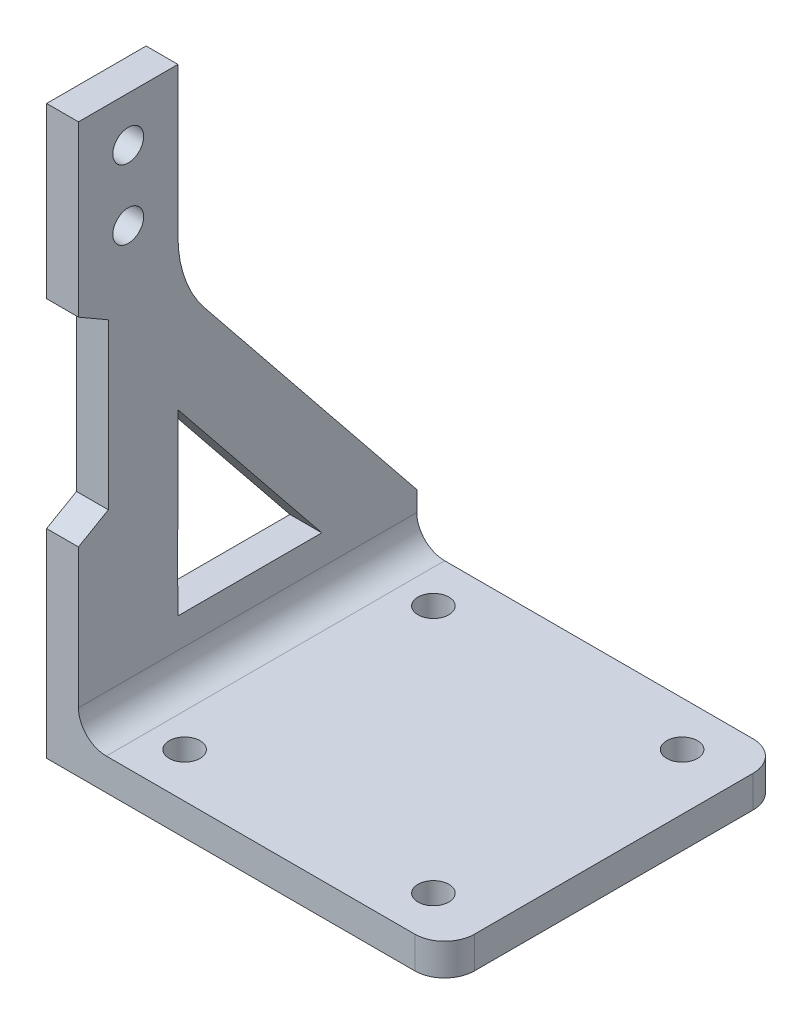
ISO-10303-21;
HEADER;
FILE_DESCRIPTION(('STEP AP214'),'2;1');
FILE_NAME('part.step','',(''),(''),'','','');
FILE_SCHEMA(('AUTOMOTIVE_DESIGN { 1 0 10303 214 1 1 1 1 }'));
ENDSEC;
DATA;
#1=APPLICATION_CONTEXT('core data for automotive mechanical design processes');
#2=APPLICATION_PROTOCOL_DEFINITION('international standard','automotive_design',2000,#1);
#3=PRODUCT_CONTEXT('',#1,'mechanical');
#4=PRODUCT('Part','Part','',(#3));
#5=PRODUCT_RELATED_PRODUCT_CATEGORY('part','',(#4));
#6=PRODUCT_DEFINITION_FORMATION('','',#4);
#7=PRODUCT_DEFINITION_CONTEXT('part definition',#1,'design');
#8=PRODUCT_DEFINITION('design','',#6,#7);
#9=PRODUCT_DEFINITION_SHAPE('','',#8);
#10=(LENGTH_UNIT() NAMED_UNIT(*) SI_UNIT(.MILLI.,.METRE.));
#11=(NAMED_UNIT(*) PLANE_ANGLE_UNIT() SI_UNIT($,.RADIAN.));
#12=(NAMED_UNIT(*) SI_UNIT($,.STERADIAN.) SOLID_ANGLE_UNIT());
#13=UNCERTAINTY_MEASURE_WITH_UNIT(LENGTH_MEASURE(1.E-05),#10,'distance_accuracy_value','');
#14=(GEOMETRIC_REPRESENTATION_CONTEXT(3) GLOBAL_UNCERTAINTY_ASSIGNED_CONTEXT((#13)) GLOBAL_UNIT_ASSIGNED_CONTEXT((#10,
#11,#12)) REPRESENTATION_CONTEXT('',''));
#15=CARTESIAN_POINT('',(0.,0.,0.));
#16=DIRECTION('',(0.,0.,1.));
#17=DIRECTION('',(1.,0.,0.));
#18=AXIS2_PLACEMENT_3D('',#15,#16,#17);
#19=CARTESIAN_POINT('',(0.,0.,-17.));
#20=DIRECTION('',(-1.,0.,0.));
#21=DIRECTION('',(0.,0.,1.));
#22=AXIS2_PLACEMENT_3D('',#19,#20,#21);
#23=PLANE('',#22);
#24=CARTESIAN_POINT('',(0.,45.47,12.));
#25=DIRECTION('',(-1.,0.,0.));
#26=DIRECTION('',(0.,0.,1.));
#27=AXIS2_PLACEMENT_3D('',#24,#25,#26);
#28=CIRCLE('',#27,1.55);
#29=CARTESIAN_POINT('',(0.,45.47,13.55));
#30=VERTEX_POINT('',#29);
#31=EDGE_CURVE('E315',#30,#30,#28,.T.);
#32=ORIENTED_EDGE('',*,*,#31,.F.);
#33=EDGE_LOOP('',(#32));
#34=FACE_BOUND('',#33,.T.);
#35=CARTESIAN_POINT('',(0.,52.47,12.));
#36=DIRECTION('',(-1.,0.,0.));
#37=DIRECTION('',(0.,0.,1.));
#38=AXIS2_PLACEMENT_3D('',#35,#36,#37);
#39=CIRCLE('',#38,1.55);
#40=CARTESIAN_POINT('',(0.,52.47,13.55));
#41=VERTEX_POINT('',#40);
#42=EDGE_CURVE('E310',#41,#41,#39,.T.);
#43=ORIENTED_EDGE('',*,*,#42,.F.);
#44=EDGE_LOOP('',(#43));
#45=FACE_BOUND('',#44,.T.);
#46=DIRECTION('',(0.,0.999965142877044,0.00834943296838955));
#47=VECTOR('',#46,1.);
#48=CARTESIAN_POINT('',(0.,12.4099026560482,7.02847174609856));
#49=LINE('',#48,#47);
#50=CARTESIAN_POINT('',(0.,9.,7.));
#51=VERTEX_POINT('',#50);
#52=CARTESIAN_POINT('',(0.,12.4099026560482,7.02847174609856));
#53=VERTEX_POINT('',#52);
#54=EDGE_CURVE('E309',#51,#53,#49,.T.);
#55=ORIENTED_EDGE('',*,*,#54,.F.);
#56=DIRECTION('',(0.,0.,1.));
#57=VECTOR('',#56,1.);
#58=CARTESIAN_POINT('',(0.,9.,-7.45470915295073));
#59=LINE('',#58,#57);
#60=CARTESIAN_POINT('',(0.,9.,-7.45470915295073));
#61=VERTEX_POINT('',#60);
#62=EDGE_CURVE('E513',#61,#51,#59,.T.);
#63=ORIENTED_EDGE('',*,*,#62,.F.);
#64=DIRECTION('',(0.,-0.778824836888192,-0.627241479373041));
#65=VECTOR('',#64,1.);
#66=CARTESIAN_POINT('',(0.,26.9537651825972,7.0046990477987));
#67=LINE('',#66,#65);
#68=CARTESIAN_POINT('',(0.,26.9537651825972,7.0046990477987));
#69=VERTEX_POINT('',#68);
#70=EDGE_CURVE('E509',#69,#61,#67,.T.);
#71=ORIENTED_EDGE('',*,*,#70,.F.);
#72=DIRECTION('',(0.,0.999998664122701,-0.00163454972838609));
#73=VECTOR('',#72,1.);
#74=CARTESIAN_POINT('',(0.,26.9537651825972,7.0046990477987));
#75=LINE('',#74,#73);
#76=EDGE_CURVE('E505',#53,#69,#75,.T.);
#77=ORIENTED_EDGE('',*,*,#76,.F.);
#78=EDGE_LOOP('',(#55,#63,#71,#77));
#79=FACE_BOUND('',#78,.T.);
#80=DIRECTION('',(0.,-1.,0.));
#81=VECTOR('',#80,1.);
#82=CARTESIAN_POINT('',(0.,0.,17.));
#83=LINE('',#82,#81);
#84=CARTESIAN_POINT('',(0.,20.,17.));
#85=VERTEX_POINT('',#84);
#86=CARTESIAN_POINT('',(0.,0.,17.));
#87=VERTEX_POINT('',#86);
#88=EDGE_CURVE('E206',#85,#87,#83,.T.);
#89=ORIENTED_EDGE('',*,*,#88,.F.);
#90=DIRECTION('',(0.,0.499999999999998,-0.86602540378444));
#91=VECTOR('',#90,1.);
#92=CARTESIAN_POINT('',(0.,20.,17.));
#93=LINE('',#92,#91);
#94=CARTESIAN_POINT('',(0.,21.7320508075689,14.));
#95=VERTEX_POINT('',#94);
#96=EDGE_CURVE('E187',#85,#95,#93,.T.);
#97=ORIENTED_EDGE('',*,*,#96,.T.);
#98=DIRECTION('',(0.,1.,0.));
#99=VECTOR('',#98,1.);
#100=CARTESIAN_POINT('',(0.,21.7320508075689,14.));
#101=LINE('',#100,#99);
#102=CARTESIAN_POINT('',(0.,38.2679491924311,14.));
#103=VERTEX_POINT('',#102);
#104=EDGE_CURVE('E196',#95,#103,#101,.T.);
#105=ORIENTED_EDGE('',*,*,#104,.T.);
#106=DIRECTION('',(0.,0.499999999999999,0.866025403784439));
#107=VECTOR('',#106,1.);
#108=CARTESIAN_POINT('',(0.,38.2679491924311,14.));
#109=LINE('',#108,#107);
#110=CARTESIAN_POINT('',(0.,40.,17.));
#111=VERTEX_POINT('',#110);
#112=EDGE_CURVE('E178',#103,#111,#109,.T.);
#113=ORIENTED_EDGE('',*,*,#112,.T.);
#114=CARTESIAN_POINT('',(0.,57.,17.));
#115=VERTEX_POINT('',#114);
#116=EDGE_CURVE('E193',#115,#111,#83,.T.);
#117=ORIENTED_EDGE('',*,*,#116,.F.);
#118=DIRECTION('',(0.,0.,1.));
#119=VECTOR('',#118,1.);
#120=CARTESIAN_POINT('',(0.,57.,-17.));
#121=LINE('',#120,#119);
#122=CARTESIAN_POINT('',(0.,57.,7.));
#123=VERTEX_POINT('',#122);
#124=EDGE_CURVE('E231',#123,#115,#121,.T.);
#125=ORIENTED_EDGE('',*,*,#124,.F.);
#126=DIRECTION('',(0.,-1.,0.));
#127=VECTOR('',#126,1.);
#128=CARTESIAN_POINT('',(0.,0.,7.));
#129=LINE('',#128,#127);
#130=CARTESIAN_POINT('',(0.,42.0313878221105,7.));
#131=VERTEX_POINT('',#130);
#132=EDGE_CURVE('E338',#123,#131,#129,.T.);
#133=ORIENTED_EDGE('',*,*,#132,.T.);
#134=CARTESIAN_POINT('',(0.,42.0313878221105,-5.));
#135=DIRECTION('',(-1.,0.,0.));
#136=DIRECTION('',(0.,0.,1.));
#137=AXIS2_PLACEMENT_3D('',#134,#135,#136);
#138=CIRCLE('',#137,12.);
#139=CARTESIAN_POINT('',(0.,34.504490069634,4.34589804265831));
#140=VERTEX_POINT('',#139);
#141=EDGE_CURVE('E11',#131,#140,#138,.F.);
#142=ORIENTED_EDGE('',*,*,#141,.T.);
#143=DIRECTION('',(0.,-0.778824836888192,-0.627241479373041));
#144=VECTOR('',#143,1.);
#145=CARTESIAN_POINT('',(0.,3.14745498756865,-20.9080899428977));
#146=LINE('',#145,#144);
#147=CARTESIAN_POINT('',(0.,7.99999999999999,-17.));
#148=VERTEX_POINT('',#147);
#149=EDGE_CURVE('E327',#140,#148,#146,.T.);
#150=ORIENTED_EDGE('',*,*,#149,.T.);
#151=DIRECTION('',(0.,-1.,0.));
#152=VECTOR('',#151,1.);
#153=CARTESIAN_POINT('',(0.,0.,-17.));
#154=LINE('',#153,#152);
#155=CARTESIAN_POINT('',(0.,0.,-17.));
#156=VERTEX_POINT('',#155);
#157=EDGE_CURVE('E222',#148,#156,#154,.T.);
#158=ORIENTED_EDGE('',*,*,#157,.T.);
#159=DIRECTION('',(0.,0.,1.));
#160=VECTOR('',#159,1.);
#161=CARTESIAN_POINT('',(0.,0.,-17.));
#162=LINE('',#161,#160);
#163=EDGE_CURVE('E226',#156,#87,#162,.T.);
#164=ORIENTED_EDGE('',*,*,#163,.T.);
#165=EDGE_LOOP('',(#89,#97,#105,#113,#117,#125,#133,#142,#150,#158,#164));
#166=FACE_BOUND('',#165,.T.);
#167=ADVANCED_FACE('F39',(#34,#45,#79,#166),#23,.T.);
#168=CARTESIAN_POINT('',(3.2,3.2,-17.));
#169=DIRECTION('',(1.,0.,0.));
#170=DIRECTION('',(0.,0.,-1.));
#171=AXIS2_PLACEMENT_3D('',#168,#169,#170);
#172=PLANE('',#171);
#173=CARTESIAN_POINT('',(3.2,45.47,12.));
#174=DIRECTION('',(1.,0.,0.));
#175=DIRECTION('',(0.,0.,-1.));
#176=AXIS2_PLACEMENT_3D('',#173,#174,#175);
#177=CIRCLE('',#176,1.55);
#178=CARTESIAN_POINT('',(3.2,45.47,10.45));
#179=VERTEX_POINT('',#178);
#180=EDGE_CURVE('E311',#179,#179,#177,.T.);
#181=ORIENTED_EDGE('',*,*,#180,.F.);
#182=EDGE_LOOP('',(#181));
#183=FACE_BOUND('',#182,.T.);
#184=CARTESIAN_POINT('',(3.2,52.47,12.));
#185=DIRECTION('',(1.,0.,0.));
#186=DIRECTION('',(0.,0.,-1.));
#187=AXIS2_PLACEMENT_3D('',#184,#185,#186);
#188=CIRCLE('',#187,1.55);
#189=CARTESIAN_POINT('',(3.2,52.47,10.45));
#190=VERTEX_POINT('',#189);
#191=EDGE_CURVE('E305',#190,#190,#188,.T.);
#192=ORIENTED_EDGE('',*,*,#191,.F.);
#193=EDGE_LOOP('',(#192));
#194=FACE_BOUND('',#193,.T.);
#195=DIRECTION('',(0.,-0.999965142877044,-0.00834943296838955));
#196=VECTOR('',#195,1.);
#197=CARTESIAN_POINT('',(3.2,3.00002492923091,6.94990186405772));
#198=LINE('',#197,#196);
#199=CARTESIAN_POINT('',(3.2,12.4099026560482,7.02847174609856));
#200=VERTEX_POINT('',#199);
#201=CARTESIAN_POINT('',(3.2,9.,7.));
#202=VERTEX_POINT('',#201);
#203=EDGE_CURVE('E301',#200,#202,#198,.T.);
#204=ORIENTED_EDGE('',*,*,#203,.F.);
#205=DIRECTION('',(0.,-0.9999986641227,0.00163454972838609));
#206=VECTOR('',#205,1.);
#207=CARTESIAN_POINT('',(3.2,3.2393002860819,7.0434615717361));
#208=LINE('',#207,#206);
#209=CARTESIAN_POINT('',(3.2,26.9537651825972,7.0046990477987));
#210=VERTEX_POINT('',#209);
#211=EDGE_CURVE('E291',#210,#200,#208,.T.);
#212=ORIENTED_EDGE('',*,*,#211,.F.);
#213=DIRECTION('',(0.,0.778824836888192,0.627241479373041));
#214=VECTOR('',#213,1.);
#215=CARTESIAN_POINT('',(3.2,0.818922970813886,-14.0434960220939));
#216=LINE('',#215,#214);
#217=CARTESIAN_POINT('',(3.2,9.,-7.45470915295073));
#218=VERTEX_POINT('',#217);
#219=EDGE_CURVE('E294',#218,#210,#216,.T.);
#220=ORIENTED_EDGE('',*,*,#219,.F.);
#221=DIRECTION('',(0.,0.,-1.));
#222=VECTOR('',#221,1.);
#223=CARTESIAN_POINT('',(3.2,9.,-17.));
#224=LINE('',#223,#222);
#225=EDGE_CURVE('E298',#202,#218,#224,.T.);
#226=ORIENTED_EDGE('',*,*,#225,.F.);
#227=EDGE_LOOP('',(#204,#212,#220,#226));
#228=FACE_BOUND('',#227,.T.);
#229=DIRECTION('',(0.,1.,0.));
#230=VECTOR('',#229,1.);
#231=CARTESIAN_POINT('',(3.2,21.7320508075689,14.));
#232=LINE('',#231,#230);
#233=CARTESIAN_POINT('',(3.2,21.7320508075689,14.));
#234=VERTEX_POINT('',#233);
#235=CARTESIAN_POINT('',(3.2,38.2679491924311,14.));
#236=VERTEX_POINT('',#235);
#237=EDGE_CURVE('E477',#234,#236,#232,.T.);
#238=ORIENTED_EDGE('',*,*,#237,.F.);
#239=DIRECTION('',(0.,0.499999999999998,-0.86602540378444));
#240=VECTOR('',#239,1.);
#241=CARTESIAN_POINT('',(3.2,20.,17.));
#242=LINE('',#241,#240);
#243=CARTESIAN_POINT('',(3.2,20.,17.));
#244=VERTEX_POINT('',#243);
#245=EDGE_CURVE('E198',#244,#234,#242,.T.);
#246=ORIENTED_EDGE('',*,*,#245,.F.);
#247=DIRECTION('',(0.,1.,0.));
#248=VECTOR('',#247,1.);
#249=CARTESIAN_POINT('',(3.2,3.2,17.));
#250=LINE('',#249,#248);
#251=CARTESIAN_POINT('',(3.2,6.,17.));
#252=VERTEX_POINT('',#251);
#253=EDGE_CURVE('E386',#252,#244,#250,.T.);
#254=ORIENTED_EDGE('',*,*,#253,.F.);
#255=DIRECTION('',(0.,0.,1.));
#256=VECTOR('',#255,1.);
#257=CARTESIAN_POINT('',(3.2,6.,-17.));
#258=LINE('',#257,#256);
#259=CARTESIAN_POINT('',(3.2,6.,-17.));
#260=VERTEX_POINT('',#259);
#261=EDGE_CURVE('E248',#252,#260,#258,.F.);
#262=ORIENTED_EDGE('',*,*,#261,.T.);
#263=DIRECTION('',(0.,1.,0.));
#264=VECTOR('',#263,1.);
#265=CARTESIAN_POINT('',(3.2,3.2,-17.));
#266=LINE('',#265,#264);
#267=CARTESIAN_POINT('',(3.2,7.99999999999999,-17.));
#268=VERTEX_POINT('',#267);
#269=EDGE_CURVE('E218',#260,#268,#266,.T.);
#270=ORIENTED_EDGE('',*,*,#269,.T.);
#271=DIRECTION('',(0.,0.778824836888192,0.627241479373041));
#272=VECTOR('',#271,1.);
#273=CARTESIAN_POINT('',(3.2,5.08847299254119,-19.3448539657386));
#274=LINE('',#273,#272);
#275=CARTESIAN_POINT('',(3.2,34.504490069634,4.34589804265831));
#276=VERTEX_POINT('',#275);
#277=EDGE_CURVE('E325',#268,#276,#274,.T.);
#278=ORIENTED_EDGE('',*,*,#277,.T.);
#279=CARTESIAN_POINT('',(3.2,42.0313878221105,-5.));
#280=DIRECTION('',(1.,0.,0.));
#281=DIRECTION('',(0.,0.,-1.));
#282=AXIS2_PLACEMENT_3D('',#279,#280,#281);
#283=CIRCLE('',#282,12.);
#284=CARTESIAN_POINT('',(3.2,42.0313878221105,7.));
#285=VERTEX_POINT('',#284);
#286=EDGE_CURVE('E48',#276,#285,#283,.F.);
#287=ORIENTED_EDGE('',*,*,#286,.T.);
#288=DIRECTION('',(0.,1.,0.));
#289=VECTOR('',#288,1.);
#290=CARTESIAN_POINT('',(3.2,3.2,7.));
#291=LINE('',#290,#289);
#292=CARTESIAN_POINT('',(3.2,57.,7.));
#293=VERTEX_POINT('',#292);
#294=EDGE_CURVE('E262',#285,#293,#291,.T.);
#295=ORIENTED_EDGE('',*,*,#294,.T.);
#296=DIRECTION('',(0.,0.,1.));
#297=VECTOR('',#296,1.);
#298=CARTESIAN_POINT('',(3.2,57.,-17.));
#299=LINE('',#298,#297);
#300=CARTESIAN_POINT('',(3.2,57.,17.));
#301=VERTEX_POINT('',#300);
#302=EDGE_CURVE('E234',#293,#301,#299,.T.);
#303=ORIENTED_EDGE('',*,*,#302,.T.);
#304=CARTESIAN_POINT('',(3.2,40.,17.));
#305=VERTEX_POINT('',#304);
#306=EDGE_CURVE('E385',#305,#301,#250,.T.);
#307=ORIENTED_EDGE('',*,*,#306,.F.);
#308=DIRECTION('',(0.,0.499999999999999,0.866025403784439));
#309=VECTOR('',#308,1.);
#310=CARTESIAN_POINT('',(3.2,38.2679491924311,14.));
#311=LINE('',#310,#309);
#312=EDGE_CURVE('E181',#236,#305,#311,.T.);
#313=ORIENTED_EDGE('',*,*,#312,.F.);
#314=EDGE_LOOP('',(#238,#246,#254,#262,#270,#278,#287,#295,#303,#307,#313));
#315=FACE_BOUND('',#314,.T.);
#316=ADVANCED_FACE('F331',(#183,#194,#228,#315),#172,.T.);
#317=CARTESIAN_POINT('',(0.,0.,17.));
#318=DIRECTION('',(0.,0.,1.));
#319=DIRECTION('',(1.,0.,0.));
#320=AXIS2_PLACEMENT_3D('',#317,#318,#319);
#321=PLANE('',#320);
#322=ORIENTED_EDGE('',*,*,#253,.T.);
#323=DIRECTION('',(-1.,0.,0.));
#324=VECTOR('',#323,1.);
#325=CARTESIAN_POINT('',(40.001,20.,17.));
#326=LINE('',#325,#324);
#327=EDGE_CURVE('E460',#244,#85,#326,.T.);
#328=ORIENTED_EDGE('',*,*,#327,.T.);
#329=ORIENTED_EDGE('',*,*,#88,.T.);
#330=DIRECTION('',(1.,0.,0.));
#331=VECTOR('',#330,1.);
#332=CARTESIAN_POINT('',(0.,0.,17.));
#333=LINE('',#332,#331);
#334=CARTESIAN_POINT('',(37.,0.,17.));
#335=VERTEX_POINT('',#334);
#336=EDGE_CURVE('E376',#87,#335,#333,.T.);
#337=ORIENTED_EDGE('',*,*,#336,.T.);
#338=DIRECTION('',(0.,1.,0.));
#339=VECTOR('',#338,1.);
#340=CARTESIAN_POINT('',(37.,0.,17.));
#341=LINE('',#340,#339);
#342=CARTESIAN_POINT('',(37.,3.2,17.));
#343=VERTEX_POINT('',#342);
#344=EDGE_CURVE('E287',#335,#343,#341,.T.);
#345=ORIENTED_EDGE('',*,*,#344,.T.);
#346=DIRECTION('',(-1.,0.,0.));
#347=VECTOR('',#346,1.);
#348=CARTESIAN_POINT('',(3.2,3.2,17.));
#349=LINE('',#348,#347);
#350=CARTESIAN_POINT('',(6.,3.2,17.));
#351=VERTEX_POINT('',#350);
#352=EDGE_CURVE('E383',#343,#351,#349,.T.);
#353=ORIENTED_EDGE('',*,*,#352,.T.);
#354=CARTESIAN_POINT('',(6.,6.,17.));
#355=DIRECTION('',(0.,0.,1.));
#356=DIRECTION('',(1.,0.,0.));
#357=AXIS2_PLACEMENT_3D('',#354,#355,#356);
#358=CIRCLE('',#357,2.8);
#359=EDGE_CURVE('E251',#351,#252,#358,.F.);
#360=ORIENTED_EDGE('',*,*,#359,.T.);
#361=EDGE_LOOP('',(#322,#328,#329,#337,#345,#353,#360));
#362=FACE_BOUND('',#361,.T.);
#363=ADVANCED_FACE('F410',(#362),#321,.T.);
#364=ORIENTED_EDGE('',*,*,#116,.T.);
#365=DIRECTION('',(-1.,0.,0.));
#366=VECTOR('',#365,1.);
#367=CARTESIAN_POINT('',(40.001,40.,17.));
#368=LINE('',#367,#366);
#369=EDGE_CURVE('E175',#305,#111,#368,.T.);
#370=ORIENTED_EDGE('',*,*,#369,.F.);
#371=ORIENTED_EDGE('',*,*,#306,.T.);
#372=DIRECTION('',(-1.,0.,0.));
#373=VECTOR('',#372,1.);
#374=CARTESIAN_POINT('',(0.,57.,17.));
#375=LINE('',#374,#373);
#376=EDGE_CURVE('E203',#301,#115,#375,.T.);
#377=ORIENTED_EDGE('',*,*,#376,.T.);
#378=EDGE_LOOP('',(#364,#370,#371,#377));
#379=FACE_BOUND('',#378,.T.);
#380=ADVANCED_FACE('F201',(#379),#321,.T.);
#381=CARTESIAN_POINT('',(0.,57.,-17.));
#382=DIRECTION('',(0.,1.,0.));
#383=DIRECTION('',(0.,0.,1.));
#384=AXIS2_PLACEMENT_3D('',#381,#382,#383);
#385=PLANE('',#384);
#386=ORIENTED_EDGE('',*,*,#302,.F.);
#387=DIRECTION('',(1.,0.,0.));
#388=VECTOR('',#387,1.);
#389=CARTESIAN_POINT('',(-1.2E-05,57.,7.));
#390=LINE('',#389,#388);
#391=EDGE_CURVE('E334',#123,#293,#390,.T.);
#392=ORIENTED_EDGE('',*,*,#391,.F.);
#393=ORIENTED_EDGE('',*,*,#124,.T.);
#394=ORIENTED_EDGE('',*,*,#376,.F.);
#395=EDGE_LOOP('',(#386,#392,#393,#394));
#396=FACE_BOUND('',#395,.T.);
#397=ADVANCED_FACE('F397',(#396),#385,.T.);
#398=CARTESIAN_POINT('',(0.,0.,-17.));
#399=DIRECTION('',(0.,0.,1.));
#400=DIRECTION('',(1.,0.,0.));
#401=AXIS2_PLACEMENT_3D('',#398,#399,#400);
#402=PLANE('',#401);
#403=DIRECTION('',(-1.,0.,0.));
#404=VECTOR('',#403,1.);
#405=CARTESIAN_POINT('',(3.2,3.2,-17.));
#406=LINE('',#405,#404);
#407=CARTESIAN_POINT('',(37.,3.2,-17.));
#408=VERTEX_POINT('',#407);
#409=CARTESIAN_POINT('',(6.,3.2,-17.));
#410=VERTEX_POINT('',#409);
#411=EDGE_CURVE('E211',#408,#410,#406,.T.);
#412=ORIENTED_EDGE('',*,*,#411,.F.);
#413=DIRECTION('',(0.,1.,0.));
#414=VECTOR('',#413,1.);
#415=CARTESIAN_POINT('',(37.,0.,-17.));
#416=LINE('',#415,#414);
#417=CARTESIAN_POINT('',(37.,0.,-17.));
#418=VERTEX_POINT('',#417);
#419=EDGE_CURVE('E278',#408,#418,#416,.F.);
#420=ORIENTED_EDGE('',*,*,#419,.T.);
#421=DIRECTION('',(1.,0.,0.));
#422=VECTOR('',#421,1.);
#423=CARTESIAN_POINT('',(0.,0.,-17.));
#424=LINE('',#423,#422);
#425=EDGE_CURVE('E205',#156,#418,#424,.T.);
#426=ORIENTED_EDGE('',*,*,#425,.F.);
#427=ORIENTED_EDGE('',*,*,#157,.F.);
#428=DIRECTION('',(-1.,0.,0.));
#429=VECTOR('',#428,1.);
#430=CARTESIAN_POINT('',(0.,7.99999999999999,-17.));
#431=LINE('',#430,#429);
#432=EDGE_CURVE('E258',#268,#148,#431,.T.);
#433=ORIENTED_EDGE('',*,*,#432,.F.);
#434=ORIENTED_EDGE('',*,*,#269,.F.);
#435=CARTESIAN_POINT('',(6.,6.,-17.));
#436=DIRECTION('',(0.,0.,1.));
#437=DIRECTION('',(1.,0.,0.));
#438=AXIS2_PLACEMENT_3D('',#435,#436,#437);
#439=CIRCLE('',#438,2.8);
#440=EDGE_CURVE('E254',#260,#410,#439,.T.);
#441=ORIENTED_EDGE('',*,*,#440,.T.);
#442=EDGE_LOOP('',(#412,#420,#426,#427,#433,#434,#441));
#443=FACE_BOUND('',#442,.T.);
#444=ADVANCED_FACE('F417',(#443),#402,.F.);
#445=CARTESIAN_POINT('',(0.,0.,-17.));
#446=DIRECTION('',(0.,-1.,0.));
#447=DIRECTION('',(0.,0.,-1.));
#448=AXIS2_PLACEMENT_3D('',#445,#446,#447);
#449=PLANE('',#448);
#450=CARTESIAN_POINT('',(34.37,0.,12.5));
#451=DIRECTION('',(0.,-1.,0.));
#452=DIRECTION('',(0.,0.,-1.));
#453=AXIS2_PLACEMENT_3D('',#450,#451,#452);
#454=CIRCLE('',#453,1.55);
#455=CARTESIAN_POINT('',(34.37,0.,10.95));
#456=VERTEX_POINT('',#455);
#457=EDGE_CURVE('E348',#456,#456,#454,.T.);
#458=ORIENTED_EDGE('',*,*,#457,.F.);
#459=EDGE_LOOP('',(#458));
#460=FACE_BOUND('',#459,.T.);
#461=CARTESIAN_POINT('',(9.37,0.,-12.5));
#462=DIRECTION('',(0.,-1.,0.));
#463=DIRECTION('',(0.,0.,-1.));
#464=AXIS2_PLACEMENT_3D('',#461,#462,#463);
#465=CIRCLE('',#464,1.55);
#466=CARTESIAN_POINT('',(9.37,0.,-14.05));
#467=VERTEX_POINT('',#466);
#468=EDGE_CURVE('E357',#467,#467,#465,.T.);
#469=ORIENTED_EDGE('',*,*,#468,.F.);
#470=EDGE_LOOP('',(#469));
#471=FACE_BOUND('',#470,.T.);
#472=CARTESIAN_POINT('',(34.37,0.,-12.5));
#473=DIRECTION('',(0.,-1.,0.));
#474=DIRECTION('',(0.,0.,-1.));
#475=AXIS2_PLACEMENT_3D('',#472,#473,#474);
#476=CIRCLE('',#475,1.55);
#477=CARTESIAN_POINT('',(34.37,0.,-14.05));
#478=VERTEX_POINT('',#477);
#479=EDGE_CURVE('E365',#478,#478,#476,.T.);
#480=ORIENTED_EDGE('',*,*,#479,.F.);
#481=EDGE_LOOP('',(#480));
#482=FACE_BOUND('',#481,.T.);
#483=CARTESIAN_POINT('',(9.37,0.,12.5));
#484=DIRECTION('',(0.,-1.,0.));
#485=DIRECTION('',(0.,0.,-1.));
#486=AXIS2_PLACEMENT_3D('',#483,#484,#485);
#487=CIRCLE('',#486,1.55);
#488=CARTESIAN_POINT('',(9.37,0.,10.95));
#489=VERTEX_POINT('',#488);
#490=EDGE_CURVE('E372',#489,#489,#487,.T.);
#491=ORIENTED_EDGE('',*,*,#490,.F.);
#492=EDGE_LOOP('',(#491));
#493=FACE_BOUND('',#492,.T.);
#494=ORIENTED_EDGE('',*,*,#425,.T.);
#495=CARTESIAN_POINT('',(37.,0.,-14.));
#496=DIRECTION('',(0.,-1.,0.));
#497=DIRECTION('',(0.,0.,-1.));
#498=AXIS2_PLACEMENT_3D('',#495,#496,#497);
#499=CIRCLE('',#498,3.);
#500=CARTESIAN_POINT('',(40.,0.,-14.));
#501=VERTEX_POINT('',#500);
#502=EDGE_CURVE('E284',#418,#501,#499,.T.);
#503=ORIENTED_EDGE('',*,*,#502,.T.);
#504=DIRECTION('',(0.,0.,1.));
#505=VECTOR('',#504,1.);
#506=CARTESIAN_POINT('',(40.,0.,-17.));
#507=LINE('',#506,#505);
#508=CARTESIAN_POINT('',(40.,0.,14.));
#509=VERTEX_POINT('',#508);
#510=EDGE_CURVE('E225',#501,#509,#507,.T.);
#511=ORIENTED_EDGE('',*,*,#510,.T.);
#512=CARTESIAN_POINT('',(37.,0.,14.));
#513=DIRECTION('',(0.,-1.,0.));
#514=DIRECTION('',(0.,0.,-1.));
#515=AXIS2_PLACEMENT_3D('',#512,#513,#514);
#516=CIRCLE('',#515,3.);
#517=EDGE_CURVE('E281',#509,#335,#516,.T.);
#518=ORIENTED_EDGE('',*,*,#517,.T.);
#519=ORIENTED_EDGE('',*,*,#336,.F.);
#520=ORIENTED_EDGE('',*,*,#163,.F.);
#521=EDGE_LOOP('',(#494,#503,#511,#518,#519,#520));
#522=FACE_BOUND('',#521,.T.);
#523=ADVANCED_FACE('F425',(#460,#471,#482,#493,#522),#449,.T.);
#524=CARTESIAN_POINT('',(3.2,3.2,-17.));
#525=DIRECTION('',(0.,1.,0.));
#526=DIRECTION('',(0.,0.,1.));
#527=AXIS2_PLACEMENT_3D('',#524,#525,#526);
#528=PLANE('',#527);
#529=CARTESIAN_POINT('',(34.37,3.2,12.5));
#530=DIRECTION('',(0.,1.,0.));
#531=DIRECTION('',(0.,0.,1.));
#532=AXIS2_PLACEMENT_3D('',#529,#530,#531);
#533=CIRCLE('',#532,1.55);
#534=CARTESIAN_POINT('',(34.37,3.2,14.05));
#535=VERTEX_POINT('',#534);
#536=EDGE_CURVE('E353',#535,#535,#533,.F.);
#537=ORIENTED_EDGE('',*,*,#536,.T.);
#538=EDGE_LOOP('',(#537));
#539=FACE_BOUND('',#538,.T.);
#540=CARTESIAN_POINT('',(9.37,3.2,-12.5));
#541=DIRECTION('',(0.,1.,0.));
#542=DIRECTION('',(0.,0.,1.));
#543=AXIS2_PLACEMENT_3D('',#540,#541,#542);
#544=CIRCLE('',#543,1.55);
#545=CARTESIAN_POINT('',(9.37,3.2,-10.95));
#546=VERTEX_POINT('',#545);
#547=EDGE_CURVE('E361',#546,#546,#544,.F.);
#548=ORIENTED_EDGE('',*,*,#547,.T.);
#549=EDGE_LOOP('',(#548));
#550=FACE_BOUND('',#549,.T.);
#551=CARTESIAN_POINT('',(34.37,3.2,-12.5));
#552=DIRECTION('',(0.,1.,0.));
#553=DIRECTION('',(0.,0.,1.));
#554=AXIS2_PLACEMENT_3D('',#551,#552,#553);
#555=CIRCLE('',#554,1.55);
#556=CARTESIAN_POINT('',(34.37,3.2,-10.95));
#557=VERTEX_POINT('',#556);
#558=EDGE_CURVE('E347',#557,#557,#555,.F.);
#559=ORIENTED_EDGE('',*,*,#558,.T.);
#560=EDGE_LOOP('',(#559));
#561=FACE_BOUND('',#560,.T.);
#562=CARTESIAN_POINT('',(9.37,3.2,12.5));
#563=DIRECTION('',(0.,1.,0.));
#564=DIRECTION('',(0.,0.,1.));
#565=AXIS2_PLACEMENT_3D('',#562,#563,#564);
#566=CIRCLE('',#565,1.55);
#567=CARTESIAN_POINT('',(9.37,3.2,14.05));
#568=VERTEX_POINT('',#567);
#569=EDGE_CURVE('E352',#568,#568,#566,.F.);
#570=ORIENTED_EDGE('',*,*,#569,.T.);
#571=EDGE_LOOP('',(#570));
#572=FACE_BOUND('',#571,.T.);
#573=DIRECTION('',(0.,0.,1.));
#574=VECTOR('',#573,1.);
#575=CARTESIAN_POINT('',(40.,3.2,-17.));
#576=LINE('',#575,#574);
#577=CARTESIAN_POINT('',(40.,3.2,-14.));
#578=VERTEX_POINT('',#577);
#579=CARTESIAN_POINT('',(40.,3.2,14.));
#580=VERTEX_POINT('',#579);
#581=EDGE_CURVE('E238',#578,#580,#576,.T.);
#582=ORIENTED_EDGE('',*,*,#581,.F.);
#583=CARTESIAN_POINT('',(37.,3.2,-14.));
#584=DIRECTION('',(0.,1.,0.));
#585=DIRECTION('',(0.,0.,1.));
#586=AXIS2_PLACEMENT_3D('',#583,#584,#585);
#587=CIRCLE('',#586,3.);
#588=EDGE_CURVE('E275',#578,#408,#587,.T.);
#589=ORIENTED_EDGE('',*,*,#588,.T.);
#590=ORIENTED_EDGE('',*,*,#411,.T.);
#591=DIRECTION('',(0.,0.,1.));
#592=VECTOR('',#591,1.);
#593=CARTESIAN_POINT('',(6.,3.2,17.));
#594=LINE('',#593,#592);
#595=EDGE_CURVE('E230',#410,#351,#594,.T.);
#596=ORIENTED_EDGE('',*,*,#595,.T.);
#597=ORIENTED_EDGE('',*,*,#352,.F.);
#598=CARTESIAN_POINT('',(37.,3.2,14.));
#599=DIRECTION('',(0.,1.,0.));
#600=DIRECTION('',(0.,0.,1.));
#601=AXIS2_PLACEMENT_3D('',#598,#599,#600);
#602=CIRCLE('',#601,3.);
#603=EDGE_CURVE('E272',#343,#580,#602,.T.);
#604=ORIENTED_EDGE('',*,*,#603,.T.);
#605=EDGE_LOOP('',(#582,#589,#590,#596,#597,#604));
#606=FACE_BOUND('',#605,.T.);
#607=ADVANCED_FACE('F421',(#539,#550,#561,#572,#606),#528,.T.);
#608=CARTESIAN_POINT('',(40.,0.,-17.));
#609=DIRECTION('',(1.,0.,0.));
#610=DIRECTION('',(0.,0.,-1.));
#611=AXIS2_PLACEMENT_3D('',#608,#609,#610);
#612=PLANE('',#611);
#613=ORIENTED_EDGE('',*,*,#510,.F.);
#614=DIRECTION('',(0.,1.,0.));
#615=VECTOR('',#614,1.);
#616=CARTESIAN_POINT('',(40.,3.2,-14.));
#617=LINE('',#616,#615);
#618=EDGE_CURVE('E268',#501,#578,#617,.T.);
#619=ORIENTED_EDGE('',*,*,#618,.T.);
#620=ORIENTED_EDGE('',*,*,#581,.T.);
#621=DIRECTION('',(0.,1.,0.));
#622=VECTOR('',#621,1.);
#623=CARTESIAN_POINT('',(40.,0.,14.));
#624=LINE('',#623,#622);
#625=EDGE_CURVE('E265',#580,#509,#624,.F.);
#626=ORIENTED_EDGE('',*,*,#625,.T.);
#627=EDGE_LOOP('',(#613,#619,#620,#626));
#628=FACE_BOUND('',#627,.T.);
#629=ADVANCED_FACE('F424',(#628),#612,.T.);
#630=CARTESIAN_POINT('',(6.,6.,-17.));
#631=DIRECTION('',(0.,0.,-1.));
#632=DIRECTION('',(-1.,0.,0.));
#633=AXIS2_PLACEMENT_3D('',#630,#631,#632);
#634=CYLINDRICAL_SURFACE('',#633,2.8);
#635=ORIENTED_EDGE('',*,*,#440,.F.);
#636=ORIENTED_EDGE('',*,*,#261,.F.);
#637=ORIENTED_EDGE('',*,*,#359,.F.);
#638=ORIENTED_EDGE('',*,*,#595,.F.);
#639=EDGE_LOOP('',(#635,#636,#637,#638));
#640=FACE_BOUND('',#639,.T.);
#641=ADVANCED_FACE('F429',(#640),#634,.F.);
#642=CARTESIAN_POINT('',(9.37,57.001,12.5));
#643=DIRECTION('',(0.,-1.,0.));
#644=DIRECTION('',(0.,0.,-1.));
#645=AXIS2_PLACEMENT_3D('',#642,#643,#644);
#646=CYLINDRICAL_SURFACE('',#645,1.55);
#647=ORIENTED_EDGE('',*,*,#569,.F.);
#648=EDGE_LOOP('',(#647));
#649=FACE_BOUND('',#648,.T.);
#650=ORIENTED_EDGE('',*,*,#490,.T.);
#651=EDGE_LOOP('',(#650));
#652=FACE_BOUND('',#651,.T.);
#653=ADVANCED_FACE('F436',(#649,#652),#646,.F.);
#654=CARTESIAN_POINT('',(34.37,57.001,-12.5));
#655=DIRECTION('',(0.,-1.,0.));
#656=DIRECTION('',(0.,0.,-1.));
#657=AXIS2_PLACEMENT_3D('',#654,#655,#656);
#658=CYLINDRICAL_SURFACE('',#657,1.55);
#659=ORIENTED_EDGE('',*,*,#558,.F.);
#660=EDGE_LOOP('',(#659));
#661=FACE_BOUND('',#660,.T.);
#662=ORIENTED_EDGE('',*,*,#479,.T.);
#663=EDGE_LOOP('',(#662));
#664=FACE_BOUND('',#663,.T.);
#665=ADVANCED_FACE('F568',(#661,#664),#658,.F.);
#666=CARTESIAN_POINT('',(9.37,57.001,-12.5));
#667=DIRECTION('',(0.,-1.,0.));
#668=DIRECTION('',(0.,0.,-1.));
#669=AXIS2_PLACEMENT_3D('',#666,#667,#668);
#670=CYLINDRICAL_SURFACE('',#669,1.55);
#671=ORIENTED_EDGE('',*,*,#547,.F.);
#672=EDGE_LOOP('',(#671));
#673=FACE_BOUND('',#672,.T.);
#674=ORIENTED_EDGE('',*,*,#468,.T.);
#675=EDGE_LOOP('',(#674));
#676=FACE_BOUND('',#675,.T.);
#677=ADVANCED_FACE('F564',(#673,#676),#670,.F.);
#678=CARTESIAN_POINT('',(34.37,57.001,12.5));
#679=DIRECTION('',(0.,-1.,0.));
#680=DIRECTION('',(0.,0.,-1.));
#681=AXIS2_PLACEMENT_3D('',#678,#679,#680);
#682=CYLINDRICAL_SURFACE('',#681,1.55);
#683=ORIENTED_EDGE('',*,*,#536,.F.);
#684=EDGE_LOOP('',(#683));
#685=FACE_BOUND('',#684,.T.);
#686=ORIENTED_EDGE('',*,*,#457,.T.);
#687=EDGE_LOOP('',(#686));
#688=FACE_BOUND('',#687,.T.);
#689=ADVANCED_FACE('F561',(#685,#688),#682,.F.);
#690=CARTESIAN_POINT('',(-1.2E-05,37.8,7.));
#691=DIRECTION('',(0.,0.627241479373041,-0.778824836888192));
#692=DIRECTION('',(0.,0.778824836888192,0.627241479373041));
#693=AXIS2_PLACEMENT_3D('',#690,#691,#692);
#694=PLANE('',#693);
#695=ORIENTED_EDGE('',*,*,#149,.F.);
#696=DIRECTION('',(1.,0.,0.));
#697=VECTOR('',#696,1.);
#698=CARTESIAN_POINT('',(3.2,34.504490069634,4.3458980426583));
#699=LINE('',#698,#697);
#700=EDGE_CURVE('E304',#140,#276,#699,.T.);
#701=ORIENTED_EDGE('',*,*,#700,.T.);
#702=ORIENTED_EDGE('',*,*,#277,.F.);
#703=ORIENTED_EDGE('',*,*,#432,.T.);
#704=EDGE_LOOP('',(#695,#701,#702,#703));
#705=FACE_BOUND('',#704,.T.);
#706=ADVANCED_FACE('F324',(#705),#694,.T.);
#707=CARTESIAN_POINT('',(-1.2E-05,57.,7.));
#708=DIRECTION('',(0.,0.,-1.));
#709=DIRECTION('',(0.,1.,0.));
#710=AXIS2_PLACEMENT_3D('',#707,#708,#709);
#711=PLANE('',#710);
#712=ORIENTED_EDGE('',*,*,#294,.F.);
#713=DIRECTION('',(1.,0.,0.));
#714=VECTOR('',#713,1.);
#715=CARTESIAN_POINT('',(0.,42.0313878221105,7.));
#716=LINE('',#715,#714);
#717=EDGE_CURVE('E55',#285,#131,#716,.F.);
#718=ORIENTED_EDGE('',*,*,#717,.T.);
#719=ORIENTED_EDGE('',*,*,#132,.F.);
#720=ORIENTED_EDGE('',*,*,#391,.T.);
#721=EDGE_LOOP('',(#712,#718,#719,#720));
#722=FACE_BOUND('',#721,.T.);
#723=ADVANCED_FACE('F441',(#722),#711,.T.);
#724=CARTESIAN_POINT('',(37.,0.,-14.));
#725=DIRECTION('',(0.,-1.,0.));
#726=DIRECTION('',(0.,0.,-1.));
#727=AXIS2_PLACEMENT_3D('',#724,#725,#726);
#728=CYLINDRICAL_SURFACE('',#727,3.);
#729=ORIENTED_EDGE('',*,*,#502,.F.);
#730=ORIENTED_EDGE('',*,*,#419,.F.);
#731=ORIENTED_EDGE('',*,*,#588,.F.);
#732=ORIENTED_EDGE('',*,*,#618,.F.);
#733=EDGE_LOOP('',(#729,#730,#731,#732));
#734=FACE_BOUND('',#733,.T.);
#735=ADVANCED_FACE('F438',(#734),#728,.T.);
#736=CARTESIAN_POINT('',(37.,0.,14.));
#737=DIRECTION('',(0.,1.,0.));
#738=DIRECTION('',(0.,0.,1.));
#739=AXIS2_PLACEMENT_3D('',#736,#737,#738);
#740=CYLINDRICAL_SURFACE('',#739,3.);
#741=ORIENTED_EDGE('',*,*,#517,.F.);
#742=ORIENTED_EDGE('',*,*,#625,.F.);
#743=ORIENTED_EDGE('',*,*,#603,.F.);
#744=ORIENTED_EDGE('',*,*,#344,.F.);
#745=EDGE_LOOP('',(#741,#742,#743,#744));
#746=FACE_BOUND('',#745,.T.);
#747=ADVANCED_FACE('F440',(#746),#740,.T.);
#748=CARTESIAN_POINT('',(5.,12.4099026560482,7.02847174609856));
#749=DIRECTION('',(0.,-0.00834943296838955,0.999965142877044));
#750=DIRECTION('',(0.,-0.999965142877044,-0.00834943296838955));
#751=AXIS2_PLACEMENT_3D('',#748,#749,#750);
#752=PLANE('',#751);
#753=ORIENTED_EDGE('',*,*,#203,.T.);
#754=DIRECTION('',(-1.,0.,0.));
#755=VECTOR('',#754,1.);
#756=CARTESIAN_POINT('',(5.,9.,7.));
#757=LINE('',#756,#755);
#758=EDGE_CURVE('E341',#202,#51,#757,.T.);
#759=ORIENTED_EDGE('',*,*,#758,.T.);
#760=ORIENTED_EDGE('',*,*,#54,.T.);
#761=DIRECTION('',(-1.,0.,0.));
#762=VECTOR('',#761,1.);
#763=CARTESIAN_POINT('',(5.,12.4099026560482,7.02847174609856));
#764=LINE('',#763,#762);
#765=EDGE_CURVE('E517',#200,#53,#764,.T.);
#766=ORIENTED_EDGE('',*,*,#765,.F.);
#767=EDGE_LOOP('',(#753,#759,#760,#766));
#768=FACE_BOUND('',#767,.T.);
#769=ADVANCED_FACE('F444',(#768),#752,.F.);
#770=CARTESIAN_POINT('',(5.,9.,-7.45470915295073));
#771=DIRECTION('',(0.,-1.,0.));
#772=DIRECTION('',(0.,0.,-1.));
#773=AXIS2_PLACEMENT_3D('',#770,#771,#772);
#774=PLANE('',#773);
#775=ORIENTED_EDGE('',*,*,#225,.T.);
#776=DIRECTION('',(-1.,0.,0.));
#777=VECTOR('',#776,1.);
#778=CARTESIAN_POINT('',(5.,9.,-7.45470915295073));
#779=LINE('',#778,#777);
#780=EDGE_CURVE('E520',#218,#61,#779,.T.);
#781=ORIENTED_EDGE('',*,*,#780,.T.);
#782=ORIENTED_EDGE('',*,*,#62,.T.);
#783=ORIENTED_EDGE('',*,*,#758,.F.);
#784=EDGE_LOOP('',(#775,#781,#782,#783));
#785=FACE_BOUND('',#784,.T.);
#786=ADVANCED_FACE('F449',(#785),#774,.F.);
#787=CARTESIAN_POINT('',(5.,26.9537651825972,7.0046990477987));
#788=DIRECTION('',(0.,0.627241479373041,-0.778824836888192));
#789=DIRECTION('',(0.,0.778824836888192,0.627241479373041));
#790=AXIS2_PLACEMENT_3D('',#787,#788,#789);
#791=PLANE('',#790);
#792=ORIENTED_EDGE('',*,*,#219,.T.);
#793=DIRECTION('',(-1.,0.,0.));
#794=VECTOR('',#793,1.);
#795=CARTESIAN_POINT('',(5.,26.9537651825972,7.0046990477987));
#796=LINE('',#795,#794);
#797=EDGE_CURVE('E523',#210,#69,#796,.T.);
#798=ORIENTED_EDGE('',*,*,#797,.T.);
#799=ORIENTED_EDGE('',*,*,#70,.T.);
#800=ORIENTED_EDGE('',*,*,#780,.F.);
#801=EDGE_LOOP('',(#792,#798,#799,#800));
#802=FACE_BOUND('',#801,.T.);
#803=ADVANCED_FACE('F539',(#802),#791,.F.);
#804=CARTESIAN_POINT('',(5.,26.9537651825972,7.0046990477987));
#805=DIRECTION('',(0.,0.00163454972838609,0.9999986641227));
#806=DIRECTION('',(0.,-0.9999986641227,0.00163454972838609));
#807=AXIS2_PLACEMENT_3D('',#804,#805,#806);
#808=PLANE('',#807);
#809=ORIENTED_EDGE('',*,*,#211,.T.);
#810=ORIENTED_EDGE('',*,*,#765,.T.);
#811=ORIENTED_EDGE('',*,*,#76,.T.);
#812=ORIENTED_EDGE('',*,*,#797,.F.);
#813=EDGE_LOOP('',(#809,#810,#811,#812));
#814=FACE_BOUND('',#813,.T.);
#815=ADVANCED_FACE('F530',(#814),#808,.F.);
#816=CARTESIAN_POINT('',(10.,52.47,12.));
#817=DIRECTION('',(-1.,0.,0.));
#818=DIRECTION('',(0.,0.,1.));
#819=AXIS2_PLACEMENT_3D('',#816,#817,#818);
#820=CYLINDRICAL_SURFACE('',#819,1.55);
#821=ORIENTED_EDGE('',*,*,#191,.T.);
#822=EDGE_LOOP('',(#821));
#823=FACE_BOUND('',#822,.T.);
#824=ORIENTED_EDGE('',*,*,#42,.T.);
#825=EDGE_LOOP('',(#824));
#826=FACE_BOUND('',#825,.T.);
#827=ADVANCED_FACE('F552',(#823,#826),#820,.F.);
#828=CARTESIAN_POINT('',(10.,45.47,12.));
#829=DIRECTION('',(-1.,0.,0.));
#830=DIRECTION('',(0.,0.,1.));
#831=AXIS2_PLACEMENT_3D('',#828,#829,#830);
#832=CYLINDRICAL_SURFACE('',#831,1.55);
#833=ORIENTED_EDGE('',*,*,#180,.T.);
#834=EDGE_LOOP('',(#833));
#835=FACE_BOUND('',#834,.T.);
#836=ORIENTED_EDGE('',*,*,#31,.T.);
#837=EDGE_LOOP('',(#836));
#838=FACE_BOUND('',#837,.T.);
#839=ADVANCED_FACE('F671',(#835,#838),#832,.F.);
#840=CARTESIAN_POINT('',(40.001,20.,17.));
#841=DIRECTION('',(0.,0.86602540378444,0.499999999999998));
#842=DIRECTION('',(0.,-0.499999999999998,0.86602540378444));
#843=AXIS2_PLACEMENT_3D('',#840,#841,#842);
#844=PLANE('',#843);
#845=ORIENTED_EDGE('',*,*,#245,.T.);
#846=DIRECTION('',(-1.,0.,0.));
#847=VECTOR('',#846,1.);
#848=CARTESIAN_POINT('',(40.001,21.7320508075689,14.));
#849=LINE('',#848,#847);
#850=EDGE_CURVE('E490',#234,#95,#849,.T.);
#851=ORIENTED_EDGE('',*,*,#850,.T.);
#852=ORIENTED_EDGE('',*,*,#96,.F.);
#853=ORIENTED_EDGE('',*,*,#327,.F.);
#854=EDGE_LOOP('',(#845,#851,#852,#853));
#855=FACE_BOUND('',#854,.T.);
#856=ADVANCED_FACE('F679',(#855),#844,.T.);
#857=CARTESIAN_POINT('',(40.001,21.7320508075689,14.));
#858=DIRECTION('',(0.,0.,1.));
#859=DIRECTION('',(1.,0.,0.));
#860=AXIS2_PLACEMENT_3D('',#857,#858,#859);
#861=PLANE('',#860);
#862=ORIENTED_EDGE('',*,*,#237,.T.);
#863=DIRECTION('',(-1.,0.,0.));
#864=VECTOR('',#863,1.);
#865=CARTESIAN_POINT('',(40.001,38.2679491924311,14.));
#866=LINE('',#865,#864);
#867=EDGE_CURVE('E186',#236,#103,#866,.T.);
#868=ORIENTED_EDGE('',*,*,#867,.T.);
#869=ORIENTED_EDGE('',*,*,#104,.F.);
#870=ORIENTED_EDGE('',*,*,#850,.F.);
#871=EDGE_LOOP('',(#862,#868,#869,#870));
#872=FACE_BOUND('',#871,.T.);
#873=ADVANCED_FACE('F402',(#872),#861,.T.);
#874=CARTESIAN_POINT('',(40.001,38.2679491924311,14.));
#875=DIRECTION('',(0.,-0.866025403784439,0.499999999999999));
#876=DIRECTION('',(0.,-0.499999999999999,-0.866025403784439));
#877=AXIS2_PLACEMENT_3D('',#874,#875,#876);
#878=PLANE('',#877);
#879=ORIENTED_EDGE('',*,*,#312,.T.);
#880=ORIENTED_EDGE('',*,*,#369,.T.);
#881=ORIENTED_EDGE('',*,*,#112,.F.);
#882=ORIENTED_EDGE('',*,*,#867,.F.);
#883=EDGE_LOOP('',(#879,#880,#881,#882));
#884=FACE_BOUND('',#883,.T.);
#885=ADVANCED_FACE('F177',(#884),#878,.T.);
#886=CARTESIAN_POINT('',(-1.2E-05,42.0313878221105,-5.));
#887=DIRECTION('',(-1.,0.,0.));
#888=DIRECTION('',(0.,0.,1.));
#889=AXIS2_PLACEMENT_3D('',#886,#887,#888);
#890=CYLINDRICAL_SURFACE('',#889,12.);
#891=ORIENTED_EDGE('',*,*,#141,.F.);
#892=ORIENTED_EDGE('',*,*,#717,.F.);
#893=ORIENTED_EDGE('',*,*,#286,.F.);
#894=ORIENTED_EDGE('',*,*,#700,.F.);
#895=EDGE_LOOP('',(#891,#892,#893,#894));
#896=FACE_BOUND('',#895,.T.);
#897=ADVANCED_FACE('F41',(#896),#890,.F.);
#898=CLOSED_SHELL('',(#167,#316,#363,#380,#397,#444,#523,#607,#629,#641,#653,#665,#677,#689,
#706,#723,#735,#747,#769,#786,#803,#815,#827,#839,#856,#873,#885,#897));
#899=MANIFOLD_SOLID_BREP('B2',#898);
#900=ADVANCED_BREP_SHAPE_REPRESENTATION('',(#18,#899),#14);
#901=SHAPE_DEFINITION_REPRESENTATION(#9,#900);
ENDSEC;
END-ISO-10303-21;
